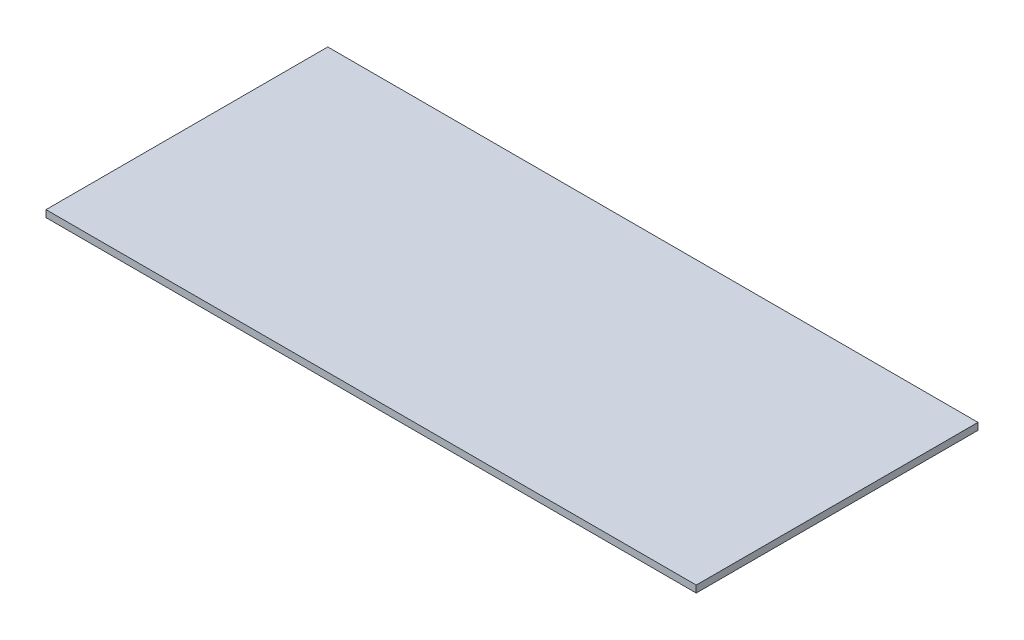
ISO-10303-21;
HEADER;
FILE_DESCRIPTION(('STEP AP214'),'2;1');
FILE_NAME('part.step','',(''),(''),'','','');
FILE_SCHEMA(('AUTOMOTIVE_DESIGN { 1 0 10303 214 1 1 1 1 }'));
ENDSEC;
DATA;
#1=APPLICATION_CONTEXT('core data for automotive mechanical design processes');
#2=APPLICATION_PROTOCOL_DEFINITION('international standard','automotive_design',2000,#1);
#3=PRODUCT_CONTEXT('',#1,'mechanical');
#4=PRODUCT('Part','Part','',(#3));
#5=PRODUCT_RELATED_PRODUCT_CATEGORY('part','',(#4));
#6=PRODUCT_DEFINITION_FORMATION('','',#4);
#7=PRODUCT_DEFINITION_CONTEXT('part definition',#1,'design');
#8=PRODUCT_DEFINITION('design','',#6,#7);
#9=PRODUCT_DEFINITION_SHAPE('','',#8);
#10=(LENGTH_UNIT() NAMED_UNIT(*) SI_UNIT(.MILLI.,.METRE.));
#11=(NAMED_UNIT(*) PLANE_ANGLE_UNIT() SI_UNIT($,.RADIAN.));
#12=(NAMED_UNIT(*) SI_UNIT($,.STERADIAN.) SOLID_ANGLE_UNIT());
#13=UNCERTAINTY_MEASURE_WITH_UNIT(LENGTH_MEASURE(1.E-05),#10,'distance_accuracy_value','');
#14=(GEOMETRIC_REPRESENTATION_CONTEXT(3) GLOBAL_UNCERTAINTY_ASSIGNED_CONTEXT((#13)) GLOBAL_UNIT_ASSIGNED_CONTEXT((#10,
#11,#12)) REPRESENTATION_CONTEXT('',''));
#15=CARTESIAN_POINT('',(0.,0.,0.));
#16=DIRECTION('',(0.,0.,1.));
#17=DIRECTION('',(1.,0.,0.));
#18=AXIS2_PLACEMENT_3D('',#15,#16,#17);
#19=CARTESIAN_POINT('',(-750.,16.,325.));
#20=DIRECTION('',(0.,0.,-1.));
#21=DIRECTION('',(-1.,0.,0.));
#22=AXIS2_PLACEMENT_3D('',#19,#20,#21);
#23=PLANE('',#22);
#24=DIRECTION('',(1.,0.,0.));
#25=VECTOR('',#24,1.);
#26=CARTESIAN_POINT('',(-750.,0.,325.));
#27=LINE('',#26,#25);
#28=CARTESIAN_POINT('',(-750.,0.,325.));
#29=VERTEX_POINT('',#28);
#30=CARTESIAN_POINT('',(750.,0.,325.));
#31=VERTEX_POINT('',#30);
#32=EDGE_CURVE('E104',#29,#31,#27,.T.);
#33=ORIENTED_EDGE('',*,*,#32,.T.);
#34=DIRECTION('',(0.,-1.,0.));
#35=VECTOR('',#34,1.);
#36=CARTESIAN_POINT('',(750.,16.,325.));
#37=LINE('',#36,#35);
#38=CARTESIAN_POINT('',(750.,16.,325.));
#39=VERTEX_POINT('',#38);
#40=EDGE_CURVE('E11',#39,#31,#37,.T.);
#41=ORIENTED_EDGE('',*,*,#40,.F.);
#42=DIRECTION('',(1.,0.,0.));
#43=VECTOR('',#42,1.);
#44=CARTESIAN_POINT('',(-750.,16.,325.));
#45=LINE('',#44,#43);
#46=CARTESIAN_POINT('',(-750.,16.,325.));
#47=VERTEX_POINT('',#46);
#48=EDGE_CURVE('E90',#47,#39,#45,.T.);
#49=ORIENTED_EDGE('',*,*,#48,.F.);
#50=DIRECTION('',(0.,-1.,0.));
#51=VECTOR('',#50,1.);
#52=CARTESIAN_POINT('',(-750.,16.,325.));
#53=LINE('',#52,#51);
#54=EDGE_CURVE('E57',#47,#29,#53,.T.);
#55=ORIENTED_EDGE('',*,*,#54,.T.);
#56=EDGE_LOOP('',(#33,#41,#49,#55));
#57=FACE_BOUND('',#56,.T.);
#58=ADVANCED_FACE('F41',(#57),#23,.F.);
#59=CARTESIAN_POINT('',(750.,16.,325.));
#60=DIRECTION('',(-1.,0.,0.));
#61=DIRECTION('',(0.,0.,1.));
#62=AXIS2_PLACEMENT_3D('',#59,#60,#61);
#63=PLANE('',#62);
#64=DIRECTION('',(0.,0.,-1.));
#65=VECTOR('',#64,1.);
#66=CARTESIAN_POINT('',(750.,0.,325.));
#67=LINE('',#66,#65);
#68=CARTESIAN_POINT('',(750.,0.,-325.));
#69=VERTEX_POINT('',#68);
#70=EDGE_CURVE('E95',#31,#69,#67,.T.);
#71=ORIENTED_EDGE('',*,*,#70,.T.);
#72=DIRECTION('',(0.,-1.,0.));
#73=VECTOR('',#72,1.);
#74=CARTESIAN_POINT('',(750.,16.,-325.));
#75=LINE('',#74,#73);
#76=CARTESIAN_POINT('',(750.,16.,-325.));
#77=VERTEX_POINT('',#76);
#78=EDGE_CURVE('E49',#77,#69,#75,.T.);
#79=ORIENTED_EDGE('',*,*,#78,.F.);
#80=DIRECTION('',(0.,0.,-1.));
#81=VECTOR('',#80,1.);
#82=CARTESIAN_POINT('',(750.,16.,325.));
#83=LINE('',#82,#81);
#84=EDGE_CURVE('E82',#39,#77,#83,.T.);
#85=ORIENTED_EDGE('',*,*,#84,.F.);
#86=ORIENTED_EDGE('',*,*,#40,.T.);
#87=EDGE_LOOP('',(#71,#79,#85,#86));
#88=FACE_BOUND('',#87,.T.);
#89=ADVANCED_FACE('F94',(#88),#63,.F.);
#90=CARTESIAN_POINT('',(-750.,16.,-325.));
#91=DIRECTION('',(0.,0.,-1.));
#92=DIRECTION('',(-1.,0.,0.));
#93=AXIS2_PLACEMENT_3D('',#90,#91,#92);
#94=PLANE('',#93);
#95=DIRECTION('',(1.,0.,0.));
#96=VECTOR('',#95,1.);
#97=CARTESIAN_POINT('',(-750.,0.,-325.));
#98=LINE('',#97,#96);
#99=CARTESIAN_POINT('',(-750.,0.,-325.));
#100=VERTEX_POINT('',#99);
#101=EDGE_CURVE('E107',#100,#69,#98,.T.);
#102=ORIENTED_EDGE('',*,*,#101,.F.);
#103=DIRECTION('',(0.,-1.,0.));
#104=VECTOR('',#103,1.);
#105=CARTESIAN_POINT('',(-750.,16.,-325.));
#106=LINE('',#105,#104);
#107=CARTESIAN_POINT('',(-750.,16.,-325.));
#108=VERTEX_POINT('',#107);
#109=EDGE_CURVE('E71',#108,#100,#106,.T.);
#110=ORIENTED_EDGE('',*,*,#109,.F.);
#111=DIRECTION('',(1.,0.,0.));
#112=VECTOR('',#111,1.);
#113=CARTESIAN_POINT('',(-750.,16.,-325.));
#114=LINE('',#113,#112);
#115=EDGE_CURVE('E89',#108,#77,#114,.T.);
#116=ORIENTED_EDGE('',*,*,#115,.T.);
#117=ORIENTED_EDGE('',*,*,#78,.T.);
#118=EDGE_LOOP('',(#102,#110,#116,#117));
#119=FACE_BOUND('',#118,.T.);
#120=ADVANCED_FACE('F98',(#119),#94,.T.);
#121=CARTESIAN_POINT('',(-750.,16.,325.));
#122=DIRECTION('',(-1.,0.,0.));
#123=DIRECTION('',(0.,0.,1.));
#124=AXIS2_PLACEMENT_3D('',#121,#122,#123);
#125=PLANE('',#124);
#126=DIRECTION('',(0.,0.,-1.));
#127=VECTOR('',#126,1.);
#128=CARTESIAN_POINT('',(-750.,0.,325.));
#129=LINE('',#128,#127);
#130=EDGE_CURVE('E109',#29,#100,#129,.T.);
#131=ORIENTED_EDGE('',*,*,#130,.F.);
#132=ORIENTED_EDGE('',*,*,#54,.F.);
#133=DIRECTION('',(0.,0.,-1.));
#134=VECTOR('',#133,1.);
#135=CARTESIAN_POINT('',(-750.,16.,325.));
#136=LINE('',#135,#134);
#137=EDGE_CURVE('E99',#47,#108,#136,.T.);
#138=ORIENTED_EDGE('',*,*,#137,.T.);
#139=ORIENTED_EDGE('',*,*,#109,.T.);
#140=EDGE_LOOP('',(#131,#132,#138,#139));
#141=FACE_BOUND('',#140,.T.);
#142=ADVANCED_FACE('F115',(#141),#125,.T.);
#143=CARTESIAN_POINT('',(0.,16.,0.));
#144=DIRECTION('',(0.,1.,0.));
#145=DIRECTION('',(0.,0.,1.));
#146=AXIS2_PLACEMENT_3D('',#143,#144,#145);
#147=PLANE('',#146);
#148=ORIENTED_EDGE('',*,*,#48,.T.);
#149=ORIENTED_EDGE('',*,*,#84,.T.);
#150=ORIENTED_EDGE('',*,*,#115,.F.);
#151=ORIENTED_EDGE('',*,*,#137,.F.);
#152=EDGE_LOOP('',(#148,#149,#150,#151));
#153=FACE_BOUND('',#152,.T.);
#154=ADVANCED_FACE('F86',(#153),#147,.T.);
#155=CARTESIAN_POINT('',(0.,0.,0.));
#156=DIRECTION('',(0.,1.,0.));
#157=DIRECTION('',(0.,0.,1.));
#158=AXIS2_PLACEMENT_3D('',#155,#156,#157);
#159=PLANE('',#158);
#160=ORIENTED_EDGE('',*,*,#32,.F.);
#161=ORIENTED_EDGE('',*,*,#130,.T.);
#162=ORIENTED_EDGE('',*,*,#101,.T.);
#163=ORIENTED_EDGE('',*,*,#70,.F.);
#164=EDGE_LOOP('',(#160,#161,#162,#163));
#165=FACE_BOUND('',#164,.T.);
#166=ADVANCED_FACE('F114',(#165),#159,.F.);
#167=CLOSED_SHELL('',(#58,#89,#120,#142,#154,#166));
#168=MANIFOLD_SOLID_BREP('B2',#167);
#169=ADVANCED_BREP_SHAPE_REPRESENTATION('',(#18,#168),#14);
#170=SHAPE_DEFINITION_REPRESENTATION(#9,#169);
ENDSEC;
END-ISO-10303-21;
